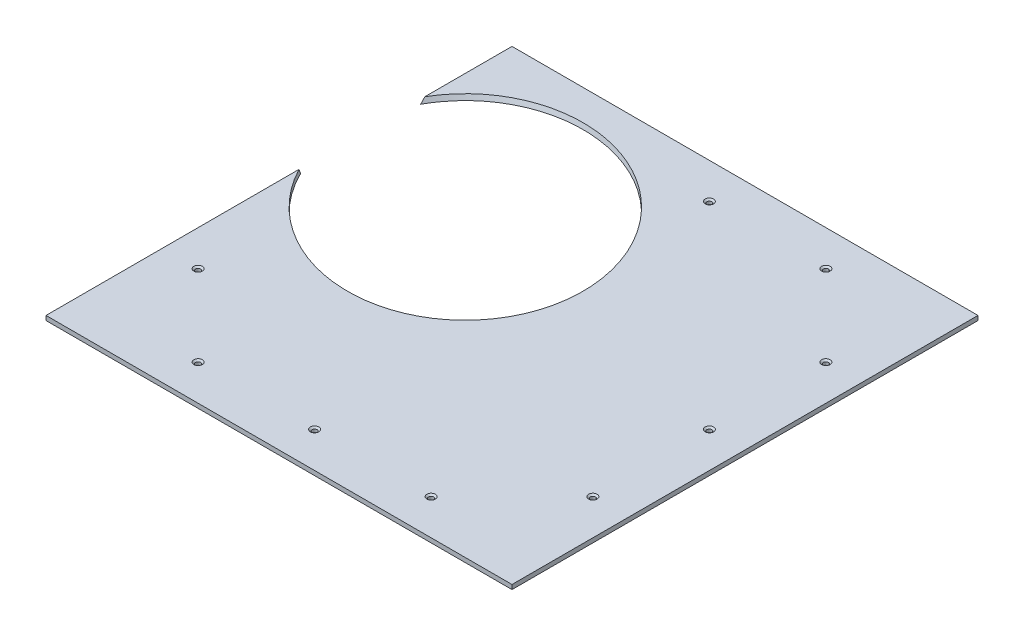
ISO-10303-21;
HEADER;
FILE_DESCRIPTION(('STEP AP214'),'2;1');
FILE_NAME('part.step','',(''),(''),'','','');
FILE_SCHEMA(('AUTOMOTIVE_DESIGN { 1 0 10303 214 1 1 1 1 }'));
ENDSEC;
DATA;
#1=APPLICATION_CONTEXT('core data for automotive mechanical design processes');
#2=APPLICATION_PROTOCOL_DEFINITION('international standard','automotive_design',2000,#1);
#3=PRODUCT_CONTEXT('',#1,'mechanical');
#4=PRODUCT('Part','Part','',(#3));
#5=PRODUCT_RELATED_PRODUCT_CATEGORY('part','',(#4));
#6=PRODUCT_DEFINITION_FORMATION('','',#4);
#7=PRODUCT_DEFINITION_CONTEXT('part definition',#1,'design');
#8=PRODUCT_DEFINITION('design','',#6,#7);
#9=PRODUCT_DEFINITION_SHAPE('','',#8);
#10=(LENGTH_UNIT() NAMED_UNIT(*) SI_UNIT(.MILLI.,.METRE.));
#11=(NAMED_UNIT(*) PLANE_ANGLE_UNIT() SI_UNIT($,.RADIAN.));
#12=(NAMED_UNIT(*) SI_UNIT($,.STERADIAN.) SOLID_ANGLE_UNIT());
#13=UNCERTAINTY_MEASURE_WITH_UNIT(LENGTH_MEASURE(1.E-05),#10,'distance_accuracy_value','');
#14=(GEOMETRIC_REPRESENTATION_CONTEXT(3) GLOBAL_UNCERTAINTY_ASSIGNED_CONTEXT((#13)) GLOBAL_UNIT_ASSIGNED_CONTEXT((#10,
#11,#12)) REPRESENTATION_CONTEXT('',''));
#15=CARTESIAN_POINT('',(0.,0.,0.));
#16=DIRECTION('',(0.,0.,1.));
#17=DIRECTION('',(1.,0.,0.));
#18=AXIS2_PLACEMENT_3D('',#15,#16,#17);
#19=CARTESIAN_POINT('',(-83.101307,94.213807,83.101307));
#20=DIRECTION('',(-1.,0.,0.));
#21=DIRECTION('',(0.,0.,-1.));
#22=AXIS2_PLACEMENT_3D('',#19,#20,#21);
#23=PLANE('',#22);
#24=CARTESIAN_POINT('',(-83.101307,213.640103266251,-66.611383919061));
#25=DIRECTION('',(-1.,0.,0.));
#26=DIRECTION('',(0.,-0.944747526340175,0.32779888876279));
#27=AXIS2_PLACEMENT_3D('',#24,#25,#26);
#28=ELLIPSE('',#27,143.222737959912,44.45);
#29=CARTESIAN_POINT('',(-83.101307,92.626307,-7.70095500486706));
#30=VERTEX_POINT('',#29);
#31=CARTESIAN_POINT('',(-83.101307,94.213807,-7.16411294595619));
#32=VERTEX_POINT('',#31);
#33=EDGE_CURVE('E113',#30,#32,#28,.T.);
#34=ORIENTED_EDGE('',*,*,#33,.F.);
#35=DIRECTION('',(0.,0.,-1.));
#36=VECTOR('',#35,1.);
#37=CARTESIAN_POINT('',(-83.101307,92.626307,83.101307));
#38=LINE('',#37,#36);
#39=CARTESIAN_POINT('',(-83.101307,92.626307,83.101307));
#40=VERTEX_POINT('',#39);
#41=EDGE_CURVE('E153',#40,#30,#38,.T.);
#42=ORIENTED_EDGE('',*,*,#41,.F.);
#43=DIRECTION('',(0.,-1.,0.));
#44=VECTOR('',#43,1.);
#45=CARTESIAN_POINT('',(-83.101307,94.213807,83.101307));
#46=LINE('',#45,#44);
#47=CARTESIAN_POINT('',(-83.101307,94.213807,83.101307));
#48=VERTEX_POINT('',#47);
#49=EDGE_CURVE('E137',#48,#40,#46,.T.);
#50=ORIENTED_EDGE('',*,*,#49,.F.);
#51=DIRECTION('',(0.,0.,-1.));
#52=VECTOR('',#51,1.);
#53=CARTESIAN_POINT('',(-83.101307,94.213807,83.101307));
#54=LINE('',#53,#52);
#55=EDGE_CURVE('E136',#48,#32,#54,.T.);
#56=ORIENTED_EDGE('',*,*,#55,.T.);
#57=EDGE_LOOP('',(#34,#42,#50,#56));
#58=FACE_BOUND('',#57,.T.);
#59=ADVANCED_FACE('F32',(#58),#23,.T.);
#60=CARTESIAN_POINT('',(83.101307,94.213807,83.101307));
#61=DIRECTION('',(1.,0.,0.));
#62=DIRECTION('',(0.,0.,1.));
#63=AXIS2_PLACEMENT_3D('',#60,#61,#62);
#64=PLANE('',#63);
#65=DIRECTION('',(0.,0.,1.));
#66=VECTOR('',#65,1.);
#67=CARTESIAN_POINT('',(83.101307,92.626307,83.101307));
#68=LINE('',#67,#66);
#69=CARTESIAN_POINT('',(83.101307,92.626307,-83.101307));
#70=VERTEX_POINT('',#69);
#71=CARTESIAN_POINT('',(83.101307,92.626307,83.101307));
#72=VERTEX_POINT('',#71);
#73=EDGE_CURVE('E145',#70,#72,#68,.T.);
#74=ORIENTED_EDGE('',*,*,#73,.F.);
#75=DIRECTION('',(0.,-1.,0.));
#76=VECTOR('',#75,1.);
#77=CARTESIAN_POINT('',(83.101307,94.213807,-83.101307));
#78=LINE('',#77,#76);
#79=CARTESIAN_POINT('',(83.101307,94.213807,-83.101307));
#80=VERTEX_POINT('',#79);
#81=EDGE_CURVE('E43',#80,#70,#78,.T.);
#82=ORIENTED_EDGE('',*,*,#81,.F.);
#83=DIRECTION('',(0.,0.,1.));
#84=VECTOR('',#83,1.);
#85=CARTESIAN_POINT('',(83.101307,94.213807,83.101307));
#86=LINE('',#85,#84);
#87=CARTESIAN_POINT('',(83.101307,94.213807,83.101307));
#88=VERTEX_POINT('',#87);
#89=EDGE_CURVE('E158',#80,#88,#86,.T.);
#90=ORIENTED_EDGE('',*,*,#89,.T.);
#91=DIRECTION('',(0.,-1.,0.));
#92=VECTOR('',#91,1.);
#93=CARTESIAN_POINT('',(83.101307,94.213807,83.101307));
#94=LINE('',#93,#92);
#95=EDGE_CURVE('E83',#88,#72,#94,.T.);
#96=ORIENTED_EDGE('',*,*,#95,.T.);
#97=EDGE_LOOP('',(#74,#82,#90,#96));
#98=FACE_BOUND('',#97,.T.);
#99=ADVANCED_FACE('F34',(#98),#64,.T.);
#100=CARTESIAN_POINT('',(83.101307,94.213807,-83.101307));
#101=DIRECTION('',(0.,0.,-1.));
#102=DIRECTION('',(1.,0.,0.));
#103=AXIS2_PLACEMENT_3D('',#100,#101,#102);
#104=PLANE('',#103);
#105=DIRECTION('',(1.,0.,0.));
#106=VECTOR('',#105,1.);
#107=CARTESIAN_POINT('',(83.101307,92.626307,-83.101307));
#108=LINE('',#107,#106);
#109=CARTESIAN_POINT('',(-83.101307,92.626307,-83.101307));
#110=VERTEX_POINT('',#109);
#111=EDGE_CURVE('E155',#110,#70,#108,.T.);
#112=ORIENTED_EDGE('',*,*,#111,.F.);
#113=DIRECTION('',(0.,-1.,0.));
#114=VECTOR('',#113,1.);
#115=CARTESIAN_POINT('',(-83.101307,94.213807,-83.101307));
#116=LINE('',#115,#114);
#117=CARTESIAN_POINT('',(-83.101307,94.213807,-83.101307));
#118=VERTEX_POINT('',#117);
#119=EDGE_CURVE('E160',#118,#110,#116,.T.);
#120=ORIENTED_EDGE('',*,*,#119,.F.);
#121=DIRECTION('',(1.,0.,0.));
#122=VECTOR('',#121,1.);
#123=CARTESIAN_POINT('',(83.101307,94.213807,-83.101307));
#124=LINE('',#123,#122);
#125=EDGE_CURVE('E138',#118,#80,#124,.T.);
#126=ORIENTED_EDGE('',*,*,#125,.T.);
#127=ORIENTED_EDGE('',*,*,#81,.T.);
#128=EDGE_LOOP('',(#112,#120,#126,#127));
#129=FACE_BOUND('',#128,.T.);
#130=ADVANCED_FACE('F167',(#129),#104,.T.);
#131=CARTESIAN_POINT('',(-83.101307,94.213807,-52.0250378643947));
#132=VERTEX_POINT('',#131);
#133=CARTESIAN_POINT('',(-83.101307,92.626307,-50.5040878601988));
#134=VERTEX_POINT('',#133);
#135=EDGE_CURVE('E111',#132,#134,#28,.T.);
#136=ORIENTED_EDGE('',*,*,#135,.F.);
#137=EDGE_CURVE('E110',#132,#118,#54,.T.);
#138=ORIENTED_EDGE('',*,*,#137,.T.);
#139=ORIENTED_EDGE('',*,*,#119,.T.);
#140=EDGE_CURVE('E152',#134,#110,#38,.T.);
#141=ORIENTED_EDGE('',*,*,#140,.F.);
#142=EDGE_LOOP('',(#136,#138,#139,#141));
#143=FACE_BOUND('',#142,.T.);
#144=ADVANCED_FACE('F290',(#143),#23,.T.);
#145=CARTESIAN_POINT('',(83.101307,94.213807,83.101307));
#146=DIRECTION('',(0.,0.,1.));
#147=DIRECTION('',(-1.,0.,0.));
#148=AXIS2_PLACEMENT_3D('',#145,#146,#147);
#149=PLANE('',#148);
#150=DIRECTION('',(-1.,0.,0.));
#151=VECTOR('',#150,1.);
#152=CARTESIAN_POINT('',(83.101307,92.626307,83.101307));
#153=LINE('',#152,#151);
#154=EDGE_CURVE('E148',#72,#40,#153,.T.);
#155=ORIENTED_EDGE('',*,*,#154,.F.);
#156=ORIENTED_EDGE('',*,*,#95,.F.);
#157=DIRECTION('',(-1.,0.,0.));
#158=VECTOR('',#157,1.);
#159=CARTESIAN_POINT('',(83.101307,94.213807,83.101307));
#160=LINE('',#159,#158);
#161=EDGE_CURVE('E141',#88,#48,#160,.T.);
#162=ORIENTED_EDGE('',*,*,#161,.T.);
#163=ORIENTED_EDGE('',*,*,#49,.T.);
#164=EDGE_LOOP('',(#155,#156,#162,#163));
#165=FACE_BOUND('',#164,.T.);
#166=ADVANCED_FACE('F164',(#165),#149,.T.);
#167=CARTESIAN_POINT('',(83.101307,94.213807,-83.101307));
#168=DIRECTION('',(0.,1.,0.));
#169=DIRECTION('',(0.,0.,-1.));
#170=AXIS2_PLACEMENT_3D('',#167,#168,#169);
#171=PLANE('',#170);
#172=CARTESIAN_POINT('',(-41.8310831525939,94.213807,-25.1740621863584));
#173=DIRECTION('',(0.,1.,0.));
#174=DIRECTION('',(0.705676740389854,0.,0.708533935724147));
#175=AXIS2_PLACEMENT_3D('',#172,#173,#174);
#176=ELLIPSE('',#175,49.4935758743306,44.45);
#177=CARTESIAN_POINT('',(-41.3993541790209,94.2138069999983,-71.9050144866692));
#178=VERTEX_POINT('',#177);
#179=EDGE_CURVE('E101',#178,#132,#176,.T.);
#180=ORIENTED_EDGE('',*,*,#179,.F.);
#181=CARTESIAN_POINT('',(-41.351491793589,94.2138069999982,-71.8994265895832));
#182=CARTESIAN_POINT('',(-41.3534875693026,94.2137720529473,-71.8996498956791));
#183=CARTESIAN_POINT('',(-41.3554832868532,94.2137414720812,-71.8998744050446));
#184=CARTESIAN_POINT('',(-41.3594743094983,94.2136890494016,-71.9003257988962));
#185=CARTESIAN_POINT('',(-41.3614696146127,94.2136672064706,-71.9005526830749));
#186=CARTESIAN_POINT('',(-41.3654598122223,94.2136322592814,-71.9010088277285));
#187=CARTESIAN_POINT('',(-41.3674547047387,94.2136191540832,-71.9012380879451));
#188=CARTESIAN_POINT('',(-41.3714440769822,94.2136016817894,-71.9016989857935));
#189=CARTESIAN_POINT('',(-41.3734385567302,94.2135973139315,-71.9019306232162));
#190=CARTESIAN_POINT('',(-41.3774271032715,94.2135973158032,-71.9023962766096));
#191=CARTESIAN_POINT('',(-41.3794211700836,94.2136016849481,-71.9026302924202));
#192=CARTESIAN_POINT('',(-41.3834088905899,94.2136191602833,-71.9031007037125));
#193=CARTESIAN_POINT('',(-41.385402544299,94.2136322660668,-71.9033370990831));
#194=CARTESIAN_POINT('',(-41.3893894384364,94.213667214192,-71.9038122706317));
#195=CARTESIAN_POINT('',(-41.391382678874,94.2136890563049,-71.9040510467474));
#196=CARTESIAN_POINT('',(-41.3953687463157,94.213741476411,-71.9045309808679));
#197=CARTESIAN_POINT('',(-41.3973615733221,94.2137720543533,-71.904772138859));
#198=CARTESIAN_POINT('',(-41.3993541790208,94.2138069999983,-71.9050144866692));
#199=B_SPLINE_CURVE_WITH_KNOTS('',3,(#181,#182,#183,#184,#185,#186,#187,#188,#189,#190,#191,
#192,#193,#194,#195,#196,#197,#198),.UNSPECIFIED.,.F.,.F.,(4,2,2,2,2,2,2,2,4),(0.,
0.00602559600430132,0.0120504211583999,0.0180745980246128,0.0240982492048326,0.0301214973330324,
0.0361444650678386,0.0421672750849792,0.0481900500698419),.UNSPECIFIED.);
#200=CARTESIAN_POINT('',(-41.3514917935887,94.213807,-71.8994265895853));
#201=VERTEX_POINT('',#200);
#202=EDGE_CURVE('E11',#201,#178,#199,.T.);
#203=ORIENTED_EDGE('',*,*,#202,.F.);
#204=EDGE_CURVE('E49',#32,#201,#176,.T.);
#205=ORIENTED_EDGE('',*,*,#204,.F.);
#206=ORIENTED_EDGE('',*,*,#55,.F.);
#207=ORIENTED_EDGE('',*,*,#161,.F.);
#208=ORIENTED_EDGE('',*,*,#89,.F.);
#209=ORIENTED_EDGE('',*,*,#125,.F.);
#210=ORIENTED_EDGE('',*,*,#137,.F.);
#211=EDGE_LOOP('',(#180,#203,#205,#206,#207,#208,#209,#210));
#212=FACE_BOUND('',#211,.T.);
#213=CARTESIAN_POINT('',(-70.4013070000004,94.213807,41.5506534999993));
#214=DIRECTION('',(0.,1.,0.));
#215=DIRECTION('',(0.,0.,-1.));
#216=AXIS2_PLACEMENT_3D('',#213,#214,#215);
#217=CIRCLE('',#216,1.51130000000001);
#218=CARTESIAN_POINT('',(-70.4013070000004,94.213807,40.0393534999993));
#219=VERTEX_POINT('',#218);
#220=EDGE_CURVE('E125',#219,#219,#217,.T.);
#221=ORIENTED_EDGE('',*,*,#220,.F.);
#222=EDGE_LOOP('',(#221));
#223=FACE_BOUND('',#222,.T.);
#224=CARTESIAN_POINT('',(41.5506534999995,94.213807,70.4013070000003));
#225=DIRECTION('',(0.,1.,0.));
#226=DIRECTION('',(0.,0.,-1.));
#227=AXIS2_PLACEMENT_3D('',#224,#225,#226);
#228=CIRCLE('',#227,1.5113);
#229=CARTESIAN_POINT('',(41.5506534999995,94.213807,68.8900070000003));
#230=VERTEX_POINT('',#229);
#231=EDGE_CURVE('E238',#230,#230,#228,.T.);
#232=ORIENTED_EDGE('',*,*,#231,.F.);
#233=EDGE_LOOP('',(#232));
#234=FACE_BOUND('',#233,.T.);
#235=CARTESIAN_POINT('',(-4.80872105109967E-13,94.213807,70.401307));
#236=DIRECTION('',(0.,1.,0.));
#237=DIRECTION('',(0.,0.,-1.));
#238=AXIS2_PLACEMENT_3D('',#235,#236,#237);
#239=CIRCLE('',#238,1.5113);
#240=CARTESIAN_POINT('',(-4.80872105109967E-13,94.213807,68.890007));
#241=VERTEX_POINT('',#240);
#242=EDGE_CURVE('E229',#241,#241,#239,.T.);
#243=ORIENTED_EDGE('',*,*,#242,.F.);
#244=EDGE_LOOP('',(#243));
#245=FACE_BOUND('',#244,.T.);
#246=CARTESIAN_POINT('',(-41.5506535000005,94.213807,70.4013069999997));
#247=DIRECTION('',(0.,1.,0.));
#248=DIRECTION('',(0.,0.,-1.));
#249=AXIS2_PLACEMENT_3D('',#246,#247,#248);
#250=CIRCLE('',#249,1.5113);
#251=CARTESIAN_POINT('',(-41.5506535000005,94.213807,68.8900069999997));
#252=VERTEX_POINT('',#251);
#253=EDGE_CURVE('E220',#252,#252,#250,.T.);
#254=ORIENTED_EDGE('',*,*,#253,.F.);
#255=EDGE_LOOP('',(#254));
#256=FACE_BOUND('',#255,.T.);
#257=CARTESIAN_POINT('',(70.4013070000001,94.213807,-41.5506534999998));
#258=DIRECTION('',(0.,1.,0.));
#259=DIRECTION('',(0.,0.,-1.));
#260=AXIS2_PLACEMENT_3D('',#257,#258,#259);
#261=CIRCLE('',#260,1.51129999999999);
#262=CARTESIAN_POINT('',(70.4013070000001,94.213807,-43.0619534999998));
#263=VERTEX_POINT('',#262);
#264=EDGE_CURVE('E211',#263,#263,#261,.T.);
#265=ORIENTED_EDGE('',*,*,#264,.F.);
#266=EDGE_LOOP('',(#265));
#267=FACE_BOUND('',#266,.T.);
#268=CARTESIAN_POINT('',(70.401307,94.213807,2.35067113119114E-13));
#269=DIRECTION('',(0.,1.,0.));
#270=DIRECTION('',(0.,0.,-1.));
#271=AXIS2_PLACEMENT_3D('',#268,#269,#270);
#272=CIRCLE('',#271,1.51129999999999);
#273=CARTESIAN_POINT('',(70.401307,94.213807,-1.51129999999976));
#274=VERTEX_POINT('',#273);
#275=EDGE_CURVE('E202',#274,#274,#272,.T.);
#276=ORIENTED_EDGE('',*,*,#275,.F.);
#277=EDGE_LOOP('',(#276));
#278=FACE_BOUND('',#277,.T.);
#279=CARTESIAN_POINT('',(70.4013069999999,94.213807,41.5506535000003));
#280=DIRECTION('',(0.,1.,0.));
#281=DIRECTION('',(0.,0.,-1.));
#282=AXIS2_PLACEMENT_3D('',#279,#280,#281);
#283=CIRCLE('',#282,1.51130000000001);
#284=CARTESIAN_POINT('',(70.4013069999999,94.213807,40.0393535000002));
#285=VERTEX_POINT('',#284);
#286=EDGE_CURVE('E193',#285,#285,#283,.T.);
#287=ORIENTED_EDGE('',*,*,#286,.F.);
#288=EDGE_LOOP('',(#287));
#289=FACE_BOUND('',#288,.T.);
#290=CARTESIAN_POINT('',(0.,94.213807,-70.401307));
#291=DIRECTION('',(0.,1.,0.));
#292=DIRECTION('',(0.,0.,-1.));
#293=AXIS2_PLACEMENT_3D('',#290,#291,#292);
#294=CIRCLE('',#293,1.5113);
#295=CARTESIAN_POINT('',(0.,94.213807,-71.912607));
#296=VERTEX_POINT('',#295);
#297=EDGE_CURVE('E184',#296,#296,#294,.T.);
#298=ORIENTED_EDGE('',*,*,#297,.F.);
#299=EDGE_LOOP('',(#298));
#300=FACE_BOUND('',#299,.T.);
#301=CARTESIAN_POINT('',(41.5506535,94.213807,-70.401307));
#302=DIRECTION('',(0.,1.,0.));
#303=DIRECTION('',(0.,0.,-1.));
#304=AXIS2_PLACEMENT_3D('',#301,#302,#303);
#305=CIRCLE('',#304,1.5113);
#306=CARTESIAN_POINT('',(41.5506535,94.213807,-71.912607));
#307=VERTEX_POINT('',#306);
#308=EDGE_CURVE('E175',#307,#307,#305,.T.);
#309=ORIENTED_EDGE('',*,*,#308,.F.);
#310=EDGE_LOOP('',(#309));
#311=FACE_BOUND('',#310,.T.);
#312=ADVANCED_FACE('F107',(#212,#223,#234,#245,#256,#267,#278,#289,#300,#311),#171,.T.);
#313=CARTESIAN_POINT('',(83.101307,92.626307,-83.101307));
#314=DIRECTION('',(0.,1.,0.));
#315=DIRECTION('',(0.,0.,-1.));
#316=AXIS2_PLACEMENT_3D('',#313,#314,#315);
#317=PLANE('',#316);
#318=CARTESIAN_POINT('',(-70.4013070000004,92.626307,41.5506534999993));
#319=DIRECTION('',(0.,1.,0.));
#320=DIRECTION('',(0.,0.,-1.));
#321=AXIS2_PLACEMENT_3D('',#318,#319,#320);
#322=CIRCLE('',#321,0.889000000000001);
#323=CARTESIAN_POINT('',(-70.4013070000004,92.626307,40.6616534999993));
#324=VERTEX_POINT('',#323);
#325=EDGE_CURVE('E241',#324,#324,#322,.T.);
#326=ORIENTED_EDGE('',*,*,#325,.T.);
#327=EDGE_LOOP('',(#326));
#328=FACE_BOUND('',#327,.T.);
#329=CARTESIAN_POINT('',(41.5506534999995,92.626307,70.4013070000003));
#330=DIRECTION('',(0.,1.,0.));
#331=DIRECTION('',(0.,0.,-1.));
#332=AXIS2_PLACEMENT_3D('',#329,#330,#331);
#333=CIRCLE('',#332,0.889000000000001);
#334=CARTESIAN_POINT('',(41.5506534999995,92.626307,69.5123070000003));
#335=VERTEX_POINT('',#334);
#336=EDGE_CURVE('E232',#335,#335,#333,.T.);
#337=ORIENTED_EDGE('',*,*,#336,.T.);
#338=EDGE_LOOP('',(#337));
#339=FACE_BOUND('',#338,.T.);
#340=CARTESIAN_POINT('',(-4.80872105109967E-13,92.626307,70.401307));
#341=DIRECTION('',(0.,1.,0.));
#342=DIRECTION('',(0.,0.,-1.));
#343=AXIS2_PLACEMENT_3D('',#340,#341,#342);
#344=CIRCLE('',#343,0.889);
#345=CARTESIAN_POINT('',(-4.80872105109967E-13,92.626307,69.512307));
#346=VERTEX_POINT('',#345);
#347=EDGE_CURVE('E223',#346,#346,#344,.T.);
#348=ORIENTED_EDGE('',*,*,#347,.T.);
#349=EDGE_LOOP('',(#348));
#350=FACE_BOUND('',#349,.T.);
#351=CARTESIAN_POINT('',(-41.5506535000005,92.626307,70.4013069999997));
#352=DIRECTION('',(0.,1.,0.));
#353=DIRECTION('',(0.,0.,-1.));
#354=AXIS2_PLACEMENT_3D('',#351,#352,#353);
#355=CIRCLE('',#354,0.889000000000001);
#356=CARTESIAN_POINT('',(-41.5506535000005,92.626307,69.5123069999997));
#357=VERTEX_POINT('',#356);
#358=EDGE_CURVE('E214',#357,#357,#355,.T.);
#359=ORIENTED_EDGE('',*,*,#358,.T.);
#360=EDGE_LOOP('',(#359));
#361=FACE_BOUND('',#360,.T.);
#362=CARTESIAN_POINT('',(70.4013070000001,92.626307,-41.5506534999998));
#363=DIRECTION('',(0.,1.,0.));
#364=DIRECTION('',(0.,0.,-1.));
#365=AXIS2_PLACEMENT_3D('',#362,#363,#364);
#366=CIRCLE('',#365,0.889000000000001);
#367=CARTESIAN_POINT('',(70.4013070000001,92.626307,-42.4396534999998));
#368=VERTEX_POINT('',#367);
#369=EDGE_CURVE('E205',#368,#368,#366,.T.);
#370=ORIENTED_EDGE('',*,*,#369,.T.);
#371=EDGE_LOOP('',(#370));
#372=FACE_BOUND('',#371,.T.);
#373=CARTESIAN_POINT('',(70.401307,92.626307,2.35067113119114E-13));
#374=DIRECTION('',(0.,1.,0.));
#375=DIRECTION('',(0.,0.,-1.));
#376=AXIS2_PLACEMENT_3D('',#373,#374,#375);
#377=CIRCLE('',#376,0.889000000000001);
#378=CARTESIAN_POINT('',(70.401307,92.626307,-0.888999999999766));
#379=VERTEX_POINT('',#378);
#380=EDGE_CURVE('E196',#379,#379,#377,.T.);
#381=ORIENTED_EDGE('',*,*,#380,.T.);
#382=EDGE_LOOP('',(#381));
#383=FACE_BOUND('',#382,.T.);
#384=CARTESIAN_POINT('',(70.4013069999999,92.626307,41.5506535000003));
#385=DIRECTION('',(0.,1.,0.));
#386=DIRECTION('',(0.,0.,-1.));
#387=AXIS2_PLACEMENT_3D('',#384,#385,#386);
#388=CIRCLE('',#387,0.889000000000001);
#389=CARTESIAN_POINT('',(70.4013069999999,92.626307,40.6616535000002));
#390=VERTEX_POINT('',#389);
#391=EDGE_CURVE('E187',#390,#390,#388,.T.);
#392=ORIENTED_EDGE('',*,*,#391,.T.);
#393=EDGE_LOOP('',(#392));
#394=FACE_BOUND('',#393,.T.);
#395=CARTESIAN_POINT('',(0.,92.626307,-70.401307));
#396=DIRECTION('',(0.,1.,0.));
#397=DIRECTION('',(0.,0.,-1.));
#398=AXIS2_PLACEMENT_3D('',#395,#396,#397);
#399=CIRCLE('',#398,0.889);
#400=CARTESIAN_POINT('',(0.,92.626307,-71.290307));
#401=VERTEX_POINT('',#400);
#402=EDGE_CURVE('E178',#401,#401,#399,.T.);
#403=ORIENTED_EDGE('',*,*,#402,.T.);
#404=EDGE_LOOP('',(#403));
#405=FACE_BOUND('',#404,.T.);
#406=CARTESIAN_POINT('',(41.5506535,92.626307,-70.401307));
#407=DIRECTION('',(0.,1.,0.));
#408=DIRECTION('',(0.,0.,-1.));
#409=AXIS2_PLACEMENT_3D('',#406,#407,#408);
#410=CIRCLE('',#409,0.889000000000001);
#411=CARTESIAN_POINT('',(41.5506535,92.626307,-71.290307));
#412=VERTEX_POINT('',#411);
#413=EDGE_CURVE('E149',#412,#412,#410,.T.);
#414=ORIENTED_EDGE('',*,*,#413,.T.);
#415=EDGE_LOOP('',(#414));
#416=FACE_BOUND('',#415,.T.);
#417=ORIENTED_EDGE('',*,*,#41,.T.);
#418=CARTESIAN_POINT('',(-41.2824897321658,92.626307,-24.6232475809719));
#419=DIRECTION('',(0.,1.,0.));
#420=DIRECTION('',(0.705676740389854,0.,0.708533935724147));
#421=AXIS2_PLACEMENT_3D('',#418,#419,#420);
#422=ELLIPSE('',#421,49.4935758743306,44.45);
#423=EDGE_CURVE('E123',#30,#134,#422,.T.);
#424=ORIENTED_EDGE('',*,*,#423,.T.);
#425=ORIENTED_EDGE('',*,*,#140,.T.);
#426=ORIENTED_EDGE('',*,*,#111,.T.);
#427=ORIENTED_EDGE('',*,*,#73,.T.);
#428=ORIENTED_EDGE('',*,*,#154,.T.);
#429=EDGE_LOOP('',(#417,#424,#425,#426,#427,#428));
#430=FACE_BOUND('',#429,.T.);
#431=ADVANCED_FACE('F165',(#328,#339,#350,#361,#372,#383,#394,#405,#416,#430),#317,.F.);
#432=CARTESIAN_POINT('',(41.5506535,94.213807,-70.401307));
#433=DIRECTION('',(0.,1.,0.));
#434=DIRECTION('',(0.,0.,-1.));
#435=AXIS2_PLACEMENT_3D('',#432,#433,#434);
#436=CYLINDRICAL_SURFACE('',#435,0.888999999999997);
#437=ORIENTED_EDGE('',*,*,#413,.F.);
#438=EDGE_LOOP('',(#437));
#439=FACE_BOUND('',#438,.T.);
#440=CARTESIAN_POINT('',(41.5506535,93.6916352995184,-70.401307));
#441=DIRECTION('',(0.,1.,0.));
#442=DIRECTION('',(0.,0.,-1.));
#443=AXIS2_PLACEMENT_3D('',#440,#441,#442);
#444=CIRCLE('',#443,0.888999999999994);
#445=CARTESIAN_POINT('',(41.5506535,93.6916352995184,-71.290307));
#446=VERTEX_POINT('',#445);
#447=EDGE_CURVE('E172',#446,#446,#444,.T.);
#448=ORIENTED_EDGE('',*,*,#447,.T.);
#449=EDGE_LOOP('',(#448));
#450=FACE_BOUND('',#449,.T.);
#451=ADVANCED_FACE('F275',(#439,#450),#436,.F.);
#452=CARTESIAN_POINT('',(41.5506535,94.213807,-70.401307));
#453=DIRECTION('',(0.,1.,0.));
#454=DIRECTION('',(0.,0.,-1.));
#455=AXIS2_PLACEMENT_3D('',#452,#453,#454);
#456=CONICAL_SURFACE('',#455,1.5113,0.872664625997172);
#457=ORIENTED_EDGE('',*,*,#447,.F.);
#458=EDGE_LOOP('',(#457));
#459=FACE_BOUND('',#458,.T.);
#460=ORIENTED_EDGE('',*,*,#308,.T.);
#461=EDGE_LOOP('',(#460));
#462=FACE_BOUND('',#461,.T.);
#463=ADVANCED_FACE('F272',(#459,#462),#456,.F.);
#464=CARTESIAN_POINT('',(0.,94.213807,-70.401307));
#465=DIRECTION('',(0.,1.,0.));
#466=DIRECTION('',(0.,0.,-1.));
#467=AXIS2_PLACEMENT_3D('',#464,#465,#466);
#468=CYLINDRICAL_SURFACE('',#467,0.888999999999998);
#469=ORIENTED_EDGE('',*,*,#402,.F.);
#470=EDGE_LOOP('',(#469));
#471=FACE_BOUND('',#470,.T.);
#472=CARTESIAN_POINT('',(0.,93.6916352995184,-70.401307));
#473=DIRECTION('',(0.,1.,0.));
#474=DIRECTION('',(0.,0.,-1.));
#475=AXIS2_PLACEMENT_3D('',#472,#473,#474);
#476=CIRCLE('',#475,0.888999999999997);
#477=CARTESIAN_POINT('',(0.,93.6916352995184,-71.290307));
#478=VERTEX_POINT('',#477);
#479=EDGE_CURVE('E181',#478,#478,#476,.T.);
#480=ORIENTED_EDGE('',*,*,#479,.T.);
#481=EDGE_LOOP('',(#480));
#482=FACE_BOUND('',#481,.T.);
#483=ADVANCED_FACE('F274',(#471,#482),#468,.F.);
#484=CARTESIAN_POINT('',(0.,94.213807,-70.401307));
#485=DIRECTION('',(0.,1.,0.));
#486=DIRECTION('',(0.,0.,-1.));
#487=AXIS2_PLACEMENT_3D('',#484,#485,#486);
#488=CONICAL_SURFACE('',#487,1.5113,0.87266462599717);
#489=ORIENTED_EDGE('',*,*,#479,.F.);
#490=EDGE_LOOP('',(#489));
#491=FACE_BOUND('',#490,.T.);
#492=ORIENTED_EDGE('',*,*,#297,.T.);
#493=EDGE_LOOP('',(#492));
#494=FACE_BOUND('',#493,.T.);
#495=ADVANCED_FACE('F282',(#491,#494),#488,.F.);
#496=CARTESIAN_POINT('',(70.4013069999999,94.213807,41.5506535000003));
#497=DIRECTION('',(0.,1.,0.));
#498=DIRECTION('',(0.,0.,-1.));
#499=AXIS2_PLACEMENT_3D('',#496,#497,#498);
#500=CYLINDRICAL_SURFACE('',#499,0.889000000000001);
#501=ORIENTED_EDGE('',*,*,#391,.F.);
#502=EDGE_LOOP('',(#501));
#503=FACE_BOUND('',#502,.T.);
#504=CARTESIAN_POINT('',(70.4013069999999,93.6916352995184,41.5506535000003));
#505=DIRECTION('',(0.,1.,0.));
#506=DIRECTION('',(0.,0.,-1.));
#507=AXIS2_PLACEMENT_3D('',#504,#505,#506);
#508=CIRCLE('',#507,0.889000000000001);
#509=CARTESIAN_POINT('',(70.4013069999999,93.6916352995184,40.6616535000002));
#510=VERTEX_POINT('',#509);
#511=EDGE_CURVE('E190',#510,#510,#508,.T.);
#512=ORIENTED_EDGE('',*,*,#511,.T.);
#513=EDGE_LOOP('',(#512));
#514=FACE_BOUND('',#513,.T.);
#515=ADVANCED_FACE('F331',(#503,#514),#500,.F.);
#516=CARTESIAN_POINT('',(70.4013069999999,94.213807,41.5506535000003));
#517=DIRECTION('',(0.,1.,0.));
#518=DIRECTION('',(0.,0.,-1.));
#519=AXIS2_PLACEMENT_3D('',#516,#517,#518);
#520=CONICAL_SURFACE('',#519,1.51130000000001,0.872664625997172);
#521=ORIENTED_EDGE('',*,*,#511,.F.);
#522=EDGE_LOOP('',(#521));
#523=FACE_BOUND('',#522,.T.);
#524=ORIENTED_EDGE('',*,*,#286,.T.);
#525=EDGE_LOOP('',(#524));
#526=FACE_BOUND('',#525,.T.);
#527=ADVANCED_FACE('F336',(#523,#526),#520,.F.);
#528=CARTESIAN_POINT('',(70.401307,94.213807,2.35067113119114E-13));
#529=DIRECTION('',(0.,1.,0.));
#530=DIRECTION('',(0.,0.,-1.));
#531=AXIS2_PLACEMENT_3D('',#528,#529,#530);
#532=CYLINDRICAL_SURFACE('',#531,0.889000000000001);
#533=ORIENTED_EDGE('',*,*,#380,.F.);
#534=EDGE_LOOP('',(#533));
#535=FACE_BOUND('',#534,.T.);
#536=CARTESIAN_POINT('',(70.401307,93.6916352995184,2.35067113119114E-13));
#537=DIRECTION('',(0.,1.,0.));
#538=DIRECTION('',(0.,0.,-1.));
#539=AXIS2_PLACEMENT_3D('',#536,#537,#538);
#540=CIRCLE('',#539,0.889000000000001);
#541=CARTESIAN_POINT('',(70.401307,93.6916352995184,-0.888999999999766));
#542=VERTEX_POINT('',#541);
#543=EDGE_CURVE('E199',#542,#542,#540,.T.);
#544=ORIENTED_EDGE('',*,*,#543,.T.);
#545=EDGE_LOOP('',(#544));
#546=FACE_BOUND('',#545,.T.);
#547=ADVANCED_FACE('F342',(#535,#546),#532,.F.);
#548=CARTESIAN_POINT('',(70.401307,94.213807,2.35067113119114E-13));
#549=DIRECTION('',(0.,1.,0.));
#550=DIRECTION('',(0.,0.,-1.));
#551=AXIS2_PLACEMENT_3D('',#548,#549,#550);
#552=CONICAL_SURFACE('',#551,1.51129999999999,0.872664625997161);
#553=ORIENTED_EDGE('',*,*,#543,.F.);
#554=EDGE_LOOP('',(#553));
#555=FACE_BOUND('',#554,.T.);
#556=ORIENTED_EDGE('',*,*,#275,.T.);
#557=EDGE_LOOP('',(#556));
#558=FACE_BOUND('',#557,.T.);
#559=ADVANCED_FACE('F346',(#555,#558),#552,.F.);
#560=CARTESIAN_POINT('',(70.4013070000001,94.213807,-41.5506534999998));
#561=DIRECTION('',(0.,1.,0.));
#562=DIRECTION('',(0.,0.,-1.));
#563=AXIS2_PLACEMENT_3D('',#560,#561,#562);
#564=CYLINDRICAL_SURFACE('',#563,0.889000000000001);
#565=ORIENTED_EDGE('',*,*,#369,.F.);
#566=EDGE_LOOP('',(#565));
#567=FACE_BOUND('',#566,.T.);
#568=CARTESIAN_POINT('',(70.4013070000001,93.6916352995184,-41.5506534999998));
#569=DIRECTION('',(0.,1.,0.));
#570=DIRECTION('',(0.,0.,-1.));
#571=AXIS2_PLACEMENT_3D('',#568,#569,#570);
#572=CIRCLE('',#571,0.889000000000001);
#573=CARTESIAN_POINT('',(70.4013070000001,93.6916352995184,-42.4396534999998));
#574=VERTEX_POINT('',#573);
#575=EDGE_CURVE('E208',#574,#574,#572,.T.);
#576=ORIENTED_EDGE('',*,*,#575,.T.);
#577=EDGE_LOOP('',(#576));
#578=FACE_BOUND('',#577,.T.);
#579=ADVANCED_FACE('F350',(#567,#578),#564,.F.);
#580=CARTESIAN_POINT('',(70.4013070000001,94.213807,-41.5506534999998));
#581=DIRECTION('',(0.,1.,0.));
#582=DIRECTION('',(0.,0.,-1.));
#583=AXIS2_PLACEMENT_3D('',#580,#581,#582);
#584=CONICAL_SURFACE('',#583,1.51129999999999,0.872664625997161);
#585=ORIENTED_EDGE('',*,*,#575,.F.);
#586=EDGE_LOOP('',(#585));
#587=FACE_BOUND('',#586,.T.);
#588=ORIENTED_EDGE('',*,*,#264,.T.);
#589=EDGE_LOOP('',(#588));
#590=FACE_BOUND('',#589,.T.);
#591=ADVANCED_FACE('F354',(#587,#590),#584,.F.);
#592=CARTESIAN_POINT('',(-41.5506535000005,94.213807,70.4013069999997));
#593=DIRECTION('',(0.,1.,0.));
#594=DIRECTION('',(0.,0.,-1.));
#595=AXIS2_PLACEMENT_3D('',#592,#593,#594);
#596=CYLINDRICAL_SURFACE('',#595,0.888999999999997);
#597=ORIENTED_EDGE('',*,*,#358,.F.);
#598=EDGE_LOOP('',(#597));
#599=FACE_BOUND('',#598,.T.);
#600=CARTESIAN_POINT('',(-41.5506535000005,93.6916352995184,70.4013069999997));
#601=DIRECTION('',(0.,1.,0.));
#602=DIRECTION('',(0.,0.,-1.));
#603=AXIS2_PLACEMENT_3D('',#600,#601,#602);
#604=CIRCLE('',#603,0.888999999999994);
#605=CARTESIAN_POINT('',(-41.5506535000005,93.6916352995184,69.5123069999997));
#606=VERTEX_POINT('',#605);
#607=EDGE_CURVE('E217',#606,#606,#604,.T.);
#608=ORIENTED_EDGE('',*,*,#607,.T.);
#609=EDGE_LOOP('',(#608));
#610=FACE_BOUND('',#609,.T.);
#611=ADVANCED_FACE('F358',(#599,#610),#596,.F.);
#612=CARTESIAN_POINT('',(-41.5506535000005,94.213807,70.4013069999997));
#613=DIRECTION('',(0.,1.,0.));
#614=DIRECTION('',(0.,0.,-1.));
#615=AXIS2_PLACEMENT_3D('',#612,#613,#614);
#616=CONICAL_SURFACE('',#615,1.5113,0.872664625997172);
#617=ORIENTED_EDGE('',*,*,#607,.F.);
#618=EDGE_LOOP('',(#617));
#619=FACE_BOUND('',#618,.T.);
#620=ORIENTED_EDGE('',*,*,#253,.T.);
#621=EDGE_LOOP('',(#620));
#622=FACE_BOUND('',#621,.T.);
#623=ADVANCED_FACE('F362',(#619,#622),#616,.F.);
#624=CARTESIAN_POINT('',(-4.80872105109967E-13,94.213807,70.401307));
#625=DIRECTION('',(0.,1.,0.));
#626=DIRECTION('',(0.,0.,-1.));
#627=AXIS2_PLACEMENT_3D('',#624,#625,#626);
#628=CYLINDRICAL_SURFACE('',#627,0.888999999999998);
#629=ORIENTED_EDGE('',*,*,#347,.F.);
#630=EDGE_LOOP('',(#629));
#631=FACE_BOUND('',#630,.T.);
#632=CARTESIAN_POINT('',(-4.80872105109967E-13,93.6916352995184,70.401307));
#633=DIRECTION('',(0.,1.,0.));
#634=DIRECTION('',(0.,0.,-1.));
#635=AXIS2_PLACEMENT_3D('',#632,#633,#634);
#636=CIRCLE('',#635,0.888999999999997);
#637=CARTESIAN_POINT('',(-4.80872105109967E-13,93.6916352995184,69.512307));
#638=VERTEX_POINT('',#637);
#639=EDGE_CURVE('E226',#638,#638,#636,.T.);
#640=ORIENTED_EDGE('',*,*,#639,.T.);
#641=EDGE_LOOP('',(#640));
#642=FACE_BOUND('',#641,.T.);
#643=ADVANCED_FACE('F366',(#631,#642),#628,.F.);
#644=CARTESIAN_POINT('',(-4.80872105109967E-13,94.213807,70.401307));
#645=DIRECTION('',(0.,1.,0.));
#646=DIRECTION('',(0.,0.,-1.));
#647=AXIS2_PLACEMENT_3D('',#644,#645,#646);
#648=CONICAL_SURFACE('',#647,1.5113,0.87266462599717);
#649=ORIENTED_EDGE('',*,*,#639,.F.);
#650=EDGE_LOOP('',(#649));
#651=FACE_BOUND('',#650,.T.);
#652=ORIENTED_EDGE('',*,*,#242,.T.);
#653=EDGE_LOOP('',(#652));
#654=FACE_BOUND('',#653,.T.);
#655=ADVANCED_FACE('F370',(#651,#654),#648,.F.);
#656=CARTESIAN_POINT('',(41.5506534999995,94.213807,70.4013070000003));
#657=DIRECTION('',(0.,1.,0.));
#658=DIRECTION('',(0.,0.,-1.));
#659=AXIS2_PLACEMENT_3D('',#656,#657,#658);
#660=CYLINDRICAL_SURFACE('',#659,0.888999999999997);
#661=ORIENTED_EDGE('',*,*,#336,.F.);
#662=EDGE_LOOP('',(#661));
#663=FACE_BOUND('',#662,.T.);
#664=CARTESIAN_POINT('',(41.5506534999995,93.6916352995184,70.4013070000003));
#665=DIRECTION('',(0.,1.,0.));
#666=DIRECTION('',(0.,0.,-1.));
#667=AXIS2_PLACEMENT_3D('',#664,#665,#666);
#668=CIRCLE('',#667,0.888999999999994);
#669=CARTESIAN_POINT('',(41.5506534999995,93.6916352995184,69.5123070000003));
#670=VERTEX_POINT('',#669);
#671=EDGE_CURVE('E235',#670,#670,#668,.T.);
#672=ORIENTED_EDGE('',*,*,#671,.T.);
#673=EDGE_LOOP('',(#672));
#674=FACE_BOUND('',#673,.T.);
#675=ADVANCED_FACE('F374',(#663,#674),#660,.F.);
#676=CARTESIAN_POINT('',(41.5506534999995,94.213807,70.4013070000003));
#677=DIRECTION('',(0.,1.,0.));
#678=DIRECTION('',(0.,0.,-1.));
#679=AXIS2_PLACEMENT_3D('',#676,#677,#678);
#680=CONICAL_SURFACE('',#679,1.5113,0.872664625997172);
#681=ORIENTED_EDGE('',*,*,#671,.F.);
#682=EDGE_LOOP('',(#681));
#683=FACE_BOUND('',#682,.T.);
#684=ORIENTED_EDGE('',*,*,#231,.T.);
#685=EDGE_LOOP('',(#684));
#686=FACE_BOUND('',#685,.T.);
#687=ADVANCED_FACE('F378',(#683,#686),#680,.F.);
#688=CARTESIAN_POINT('',(-70.4013070000004,94.213807,41.5506534999993));
#689=DIRECTION('',(0.,1.,0.));
#690=DIRECTION('',(0.,0.,-1.));
#691=AXIS2_PLACEMENT_3D('',#688,#689,#690);
#692=CYLINDRICAL_SURFACE('',#691,0.889000000000001);
#693=ORIENTED_EDGE('',*,*,#325,.F.);
#694=EDGE_LOOP('',(#693));
#695=FACE_BOUND('',#694,.T.);
#696=CARTESIAN_POINT('',(-70.4013070000004,93.6916352995184,41.5506534999993));
#697=DIRECTION('',(0.,1.,0.));
#698=DIRECTION('',(0.,0.,-1.));
#699=AXIS2_PLACEMENT_3D('',#696,#697,#698);
#700=CIRCLE('',#699,0.889000000000001);
#701=CARTESIAN_POINT('',(-70.4013070000004,93.6916352995184,40.6616534999993));
#702=VERTEX_POINT('',#701);
#703=EDGE_CURVE('E130',#702,#702,#700,.T.);
#704=ORIENTED_EDGE('',*,*,#703,.T.);
#705=EDGE_LOOP('',(#704));
#706=FACE_BOUND('',#705,.T.);
#707=ADVANCED_FACE('F247',(#695,#706),#692,.F.);
#708=CARTESIAN_POINT('',(-70.4013070000004,94.213807,41.5506534999993));
#709=DIRECTION('',(0.,1.,0.));
#710=DIRECTION('',(0.,0.,-1.));
#711=AXIS2_PLACEMENT_3D('',#708,#709,#710);
#712=CONICAL_SURFACE('',#711,1.51130000000001,0.872664625997172);
#713=ORIENTED_EDGE('',*,*,#703,.F.);
#714=EDGE_LOOP('',(#713));
#715=FACE_BOUND('',#714,.T.);
#716=ORIENTED_EDGE('',*,*,#220,.T.);
#717=EDGE_LOOP('',(#716));
#718=FACE_BOUND('',#717,.T.);
#719=ADVANCED_FACE('F249',(#715,#718),#712,.F.);
#720=CARTESIAN_POINT('',(-51.4084428834767,121.928427712937,-34.7901994282058));
#721=DIRECTION('',(0.310355748208371,-0.898096353208812,0.311612339144416));
#722=DIRECTION('',(0.,-0.32779888876279,-0.944747526340175));
#723=AXIS2_PLACEMENT_3D('',#720,#721,#722);
#724=CYLINDRICAL_SURFACE('',#723,44.45);
#725=ORIENTED_EDGE('',*,*,#33,.T.);
#726=ORIENTED_EDGE('',*,*,#204,.T.);
#727=ORIENTED_EDGE('',*,*,#202,.T.);
#728=ORIENTED_EDGE('',*,*,#179,.T.);
#729=ORIENTED_EDGE('',*,*,#135,.T.);
#730=ORIENTED_EDGE('',*,*,#423,.F.);
#731=EDGE_LOOP('',(#725,#726,#727,#728,#729,#730));
#732=FACE_BOUND('',#731,.T.);
#733=ADVANCED_FACE('F100',(#732),#724,.F.);
#734=CLOSED_SHELL('',(#59,#99,#130,#144,#166,#312,#431,#451,#463,#483,#495,#515,#527,#547,#559,
#579,#591,#611,#623,#643,#655,#675,#687,#707,#719,#733));
#735=MANIFOLD_SOLID_BREP('B2',#734);
#736=ADVANCED_BREP_SHAPE_REPRESENTATION('',(#18,#735),#14);
#737=SHAPE_DEFINITION_REPRESENTATION(#9,#736);
ENDSEC;
END-ISO-10303-21;
